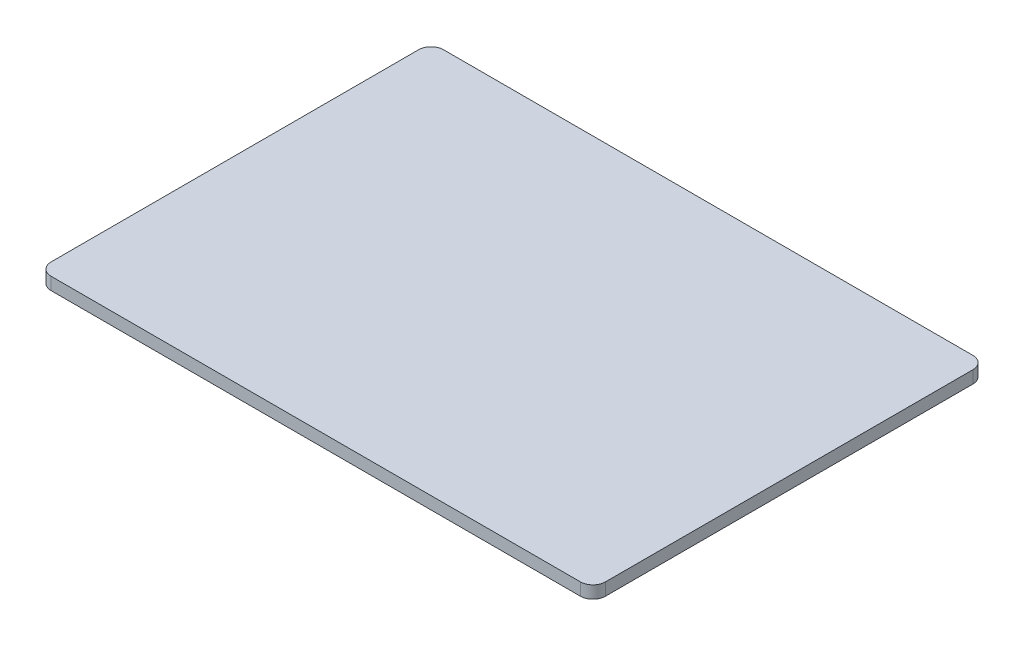
ISO-10303-21;
HEADER;
FILE_DESCRIPTION(('STEP AP214'),'2;1');
FILE_NAME('part.step','',(''),(''),'','','');
FILE_SCHEMA(('AUTOMOTIVE_DESIGN { 1 0 10303 214 1 1 1 1 }'));
ENDSEC;
DATA;
#1=APPLICATION_CONTEXT('core data for automotive mechanical design processes');
#2=APPLICATION_PROTOCOL_DEFINITION('international standard','automotive_design',2000,#1);
#3=PRODUCT_CONTEXT('',#1,'mechanical');
#4=PRODUCT('Part','Part','',(#3));
#5=PRODUCT_RELATED_PRODUCT_CATEGORY('part','',(#4));
#6=PRODUCT_DEFINITION_FORMATION('','',#4);
#7=PRODUCT_DEFINITION_CONTEXT('part definition',#1,'design');
#8=PRODUCT_DEFINITION('design','',#6,#7);
#9=PRODUCT_DEFINITION_SHAPE('','',#8);
#10=(LENGTH_UNIT() NAMED_UNIT(*) SI_UNIT(.MILLI.,.METRE.));
#11=(NAMED_UNIT(*) PLANE_ANGLE_UNIT() SI_UNIT($,.RADIAN.));
#12=(NAMED_UNIT(*) SI_UNIT($,.STERADIAN.) SOLID_ANGLE_UNIT());
#13=UNCERTAINTY_MEASURE_WITH_UNIT(LENGTH_MEASURE(1.E-05),#10,'distance_accuracy_value','');
#14=(GEOMETRIC_REPRESENTATION_CONTEXT(3) GLOBAL_UNCERTAINTY_ASSIGNED_CONTEXT((#13)) GLOBAL_UNIT_ASSIGNED_CONTEXT((#10,
#11,#12)) REPRESENTATION_CONTEXT('',''));
#15=CARTESIAN_POINT('',(0.,0.,0.));
#16=DIRECTION('',(0.,0.,1.));
#17=DIRECTION('',(1.,0.,0.));
#18=AXIS2_PLACEMENT_3D('',#15,#16,#17);
#19=CARTESIAN_POINT('',(110.46,2.54,-77.46));
#20=DIRECTION('',(0.,-1.,0.));
#21=DIRECTION('',(0.,0.,-1.));
#22=AXIS2_PLACEMENT_3D('',#19,#20,#21);
#23=CYLINDRICAL_SURFACE('',#22,2.54);
#24=CARTESIAN_POINT('',(110.46,0.,-77.46));
#25=DIRECTION('',(0.,1.,0.));
#26=DIRECTION('',(0.,0.,-1.));
#27=AXIS2_PLACEMENT_3D('',#24,#25,#26);
#28=CIRCLE('',#27,2.54);
#29=CARTESIAN_POINT('',(113.,0.,-77.46));
#30=VERTEX_POINT('',#29);
#31=CARTESIAN_POINT('',(110.46,0.,-80.));
#32=VERTEX_POINT('',#31);
#33=EDGE_CURVE('E130',#30,#32,#28,.T.);
#34=ORIENTED_EDGE('',*,*,#33,.T.);
#35=DIRECTION('',(0.,-1.,0.));
#36=VECTOR('',#35,1.);
#37=CARTESIAN_POINT('',(110.46,2.54,-80.));
#38=LINE('',#37,#36);
#39=CARTESIAN_POINT('',(110.46,2.54,-80.));
#40=VERTEX_POINT('',#39);
#41=EDGE_CURVE('E11',#40,#32,#38,.T.);
#42=ORIENTED_EDGE('',*,*,#41,.F.);
#43=CARTESIAN_POINT('',(110.46,2.54,-77.46));
#44=DIRECTION('',(0.,1.,0.));
#45=DIRECTION('',(0.,0.,-1.));
#46=AXIS2_PLACEMENT_3D('',#43,#44,#45);
#47=CIRCLE('',#46,2.54);
#48=CARTESIAN_POINT('',(113.,2.54,-77.46));
#49=VERTEX_POINT('',#48);
#50=EDGE_CURVE('E144',#49,#40,#47,.T.);
#51=ORIENTED_EDGE('',*,*,#50,.F.);
#52=DIRECTION('',(0.,-1.,0.));
#53=VECTOR('',#52,1.);
#54=CARTESIAN_POINT('',(113.,2.54,-77.46));
#55=LINE('',#54,#53);
#56=EDGE_CURVE('E126',#49,#30,#55,.T.);
#57=ORIENTED_EDGE('',*,*,#56,.T.);
#58=EDGE_LOOP('',(#34,#42,#51,#57));
#59=FACE_BOUND('',#58,.T.);
#60=ADVANCED_FACE('F34',(#59),#23,.T.);
#61=CARTESIAN_POINT('',(2.54000000000002,2.54,-80.));
#62=DIRECTION('',(0.,0.,1.));
#63=DIRECTION('',(1.,0.,0.));
#64=AXIS2_PLACEMENT_3D('',#61,#62,#63);
#65=PLANE('',#64);
#66=DIRECTION('',(-1.,0.,0.));
#67=VECTOR('',#66,1.);
#68=CARTESIAN_POINT('',(2.54000000000002,0.,-80.));
#69=LINE('',#68,#67);
#70=CARTESIAN_POINT('',(2.54000000000002,0.,-80.));
#71=VERTEX_POINT('',#70);
#72=EDGE_CURVE('E133',#32,#71,#69,.T.);
#73=ORIENTED_EDGE('',*,*,#72,.T.);
#74=DIRECTION('',(0.,-1.,0.));
#75=VECTOR('',#74,1.);
#76=CARTESIAN_POINT('',(2.54000000000002,2.54,-80.));
#77=LINE('',#76,#75);
#78=CARTESIAN_POINT('',(2.54000000000002,2.54,-80.));
#79=VERTEX_POINT('',#78);
#80=EDGE_CURVE('E42',#79,#71,#77,.T.);
#81=ORIENTED_EDGE('',*,*,#80,.F.);
#82=DIRECTION('',(-1.,0.,0.));
#83=VECTOR('',#82,1.);
#84=CARTESIAN_POINT('',(2.54000000000002,2.54,-80.));
#85=LINE('',#84,#83);
#86=EDGE_CURVE('E93',#40,#79,#85,.T.);
#87=ORIENTED_EDGE('',*,*,#86,.F.);
#88=ORIENTED_EDGE('',*,*,#41,.T.);
#89=EDGE_LOOP('',(#73,#81,#87,#88));
#90=FACE_BOUND('',#89,.T.);
#91=ADVANCED_FACE('F179',(#90),#65,.F.);
#92=CARTESIAN_POINT('',(2.54,2.54,-77.46));
#93=DIRECTION('',(0.,-1.,0.));
#94=DIRECTION('',(0.,0.,-1.));
#95=AXIS2_PLACEMENT_3D('',#92,#93,#94);
#96=CYLINDRICAL_SURFACE('',#95,2.54);
#97=CARTESIAN_POINT('',(2.54,0.,-77.46));
#98=DIRECTION('',(0.,1.,0.));
#99=DIRECTION('',(0.,0.,-1.));
#100=AXIS2_PLACEMENT_3D('',#97,#98,#99);
#101=CIRCLE('',#100,2.54);
#102=CARTESIAN_POINT('',(0.,0.,-77.46));
#103=VERTEX_POINT('',#102);
#104=EDGE_CURVE('E135',#71,#103,#101,.T.);
#105=ORIENTED_EDGE('',*,*,#104,.T.);
#106=DIRECTION('',(0.,-1.,0.));
#107=VECTOR('',#106,1.);
#108=CARTESIAN_POINT('',(0.,2.54,-77.46));
#109=LINE('',#108,#107);
#110=CARTESIAN_POINT('',(0.,2.54,-77.46));
#111=VERTEX_POINT('',#110);
#112=EDGE_CURVE('E151',#111,#103,#109,.T.);
#113=ORIENTED_EDGE('',*,*,#112,.F.);
#114=CARTESIAN_POINT('',(2.54,2.54,-77.46));
#115=DIRECTION('',(0.,1.,0.));
#116=DIRECTION('',(0.,0.,-1.));
#117=AXIS2_PLACEMENT_3D('',#114,#115,#116);
#118=CIRCLE('',#117,2.54);
#119=EDGE_CURVE('E159',#79,#111,#118,.T.);
#120=ORIENTED_EDGE('',*,*,#119,.F.);
#121=ORIENTED_EDGE('',*,*,#80,.T.);
#122=EDGE_LOOP('',(#105,#113,#120,#121));
#123=FACE_BOUND('',#122,.T.);
#124=ADVANCED_FACE('F157',(#123),#96,.T.);
#125=CARTESIAN_POINT('',(0.,2.54,-2.54000000000002));
#126=DIRECTION('',(1.,0.,0.));
#127=DIRECTION('',(0.,0.,-1.));
#128=AXIS2_PLACEMENT_3D('',#125,#126,#127);
#129=PLANE('',#128);
#130=DIRECTION('',(0.,0.,1.));
#131=VECTOR('',#130,1.);
#132=CARTESIAN_POINT('',(0.,0.,-2.54000000000002));
#133=LINE('',#132,#131);
#134=CARTESIAN_POINT('',(0.,0.,-2.54000000000002));
#135=VERTEX_POINT('',#134);
#136=EDGE_CURVE('E137',#103,#135,#133,.T.);
#137=ORIENTED_EDGE('',*,*,#136,.T.);
#138=DIRECTION('',(0.,-1.,0.));
#139=VECTOR('',#138,1.);
#140=CARTESIAN_POINT('',(0.,2.54,-2.54000000000002));
#141=LINE('',#140,#139);
#142=CARTESIAN_POINT('',(0.,2.54,-2.54000000000002));
#143=VERTEX_POINT('',#142);
#144=EDGE_CURVE('E148',#143,#135,#141,.T.);
#145=ORIENTED_EDGE('',*,*,#144,.F.);
#146=DIRECTION('',(0.,0.,1.));
#147=VECTOR('',#146,1.);
#148=CARTESIAN_POINT('',(0.,2.54,-2.54000000000002));
#149=LINE('',#148,#147);
#150=EDGE_CURVE('E171',#111,#143,#149,.T.);
#151=ORIENTED_EDGE('',*,*,#150,.F.);
#152=ORIENTED_EDGE('',*,*,#112,.T.);
#153=EDGE_LOOP('',(#137,#145,#151,#152));
#154=FACE_BOUND('',#153,.T.);
#155=ADVANCED_FACE('F167',(#154),#129,.F.);
#156=CARTESIAN_POINT('',(2.54,2.54,-2.54));
#157=DIRECTION('',(0.,-1.,0.));
#158=DIRECTION('',(0.,0.,-1.));
#159=AXIS2_PLACEMENT_3D('',#156,#157,#158);
#160=CYLINDRICAL_SURFACE('',#159,2.54);
#161=CARTESIAN_POINT('',(2.54,0.,-2.54));
#162=DIRECTION('',(0.,1.,0.));
#163=DIRECTION('',(0.,0.,-1.));
#164=AXIS2_PLACEMENT_3D('',#161,#162,#163);
#165=CIRCLE('',#164,2.54);
#166=CARTESIAN_POINT('',(2.54000000000002,0.,0.));
#167=VERTEX_POINT('',#166);
#168=EDGE_CURVE('E139',#135,#167,#165,.T.);
#169=ORIENTED_EDGE('',*,*,#168,.T.);
#170=DIRECTION('',(0.,-1.,0.));
#171=VECTOR('',#170,1.);
#172=CARTESIAN_POINT('',(2.54000000000002,2.54,0.));
#173=LINE('',#172,#171);
#174=CARTESIAN_POINT('',(2.54000000000002,2.54,0.));
#175=VERTEX_POINT('',#174);
#176=EDGE_CURVE('E121',#175,#167,#173,.T.);
#177=ORIENTED_EDGE('',*,*,#176,.F.);
#178=CARTESIAN_POINT('',(2.54,2.54,-2.54));
#179=DIRECTION('',(0.,1.,0.));
#180=DIRECTION('',(0.,0.,-1.));
#181=AXIS2_PLACEMENT_3D('',#178,#179,#180);
#182=CIRCLE('',#181,2.54);
#183=EDGE_CURVE('E112',#143,#175,#182,.T.);
#184=ORIENTED_EDGE('',*,*,#183,.F.);
#185=ORIENTED_EDGE('',*,*,#144,.T.);
#186=EDGE_LOOP('',(#169,#177,#184,#185));
#187=FACE_BOUND('',#186,.T.);
#188=ADVANCED_FACE('F170',(#187),#160,.T.);
#189=CARTESIAN_POINT('',(2.54000000000002,2.54,0.));
#190=DIRECTION('',(0.,0.,-1.));
#191=DIRECTION('',(-1.,0.,0.));
#192=AXIS2_PLACEMENT_3D('',#189,#190,#191);
#193=PLANE('',#192);
#194=DIRECTION('',(1.,0.,0.));
#195=VECTOR('',#194,1.);
#196=CARTESIAN_POINT('',(2.54000000000002,0.,0.));
#197=LINE('',#196,#195);
#198=CARTESIAN_POINT('',(110.46,0.,0.));
#199=VERTEX_POINT('',#198);
#200=EDGE_CURVE('E120',#167,#199,#197,.T.);
#201=ORIENTED_EDGE('',*,*,#200,.T.);
#202=DIRECTION('',(0.,-1.,0.));
#203=VECTOR('',#202,1.);
#204=CARTESIAN_POINT('',(110.46,2.54,0.));
#205=LINE('',#204,#203);
#206=CARTESIAN_POINT('',(110.46,2.54,0.));
#207=VERTEX_POINT('',#206);
#208=EDGE_CURVE('E117',#207,#199,#205,.T.);
#209=ORIENTED_EDGE('',*,*,#208,.F.);
#210=DIRECTION('',(1.,0.,0.));
#211=VECTOR('',#210,1.);
#212=CARTESIAN_POINT('',(2.54000000000002,2.54,0.));
#213=LINE('',#212,#211);
#214=EDGE_CURVE('E106',#175,#207,#213,.T.);
#215=ORIENTED_EDGE('',*,*,#214,.F.);
#216=ORIENTED_EDGE('',*,*,#176,.T.);
#217=EDGE_LOOP('',(#201,#209,#215,#216));
#218=FACE_BOUND('',#217,.T.);
#219=ADVANCED_FACE('F118',(#218),#193,.F.);
#220=CARTESIAN_POINT('',(110.46,2.54,-2.54));
#221=DIRECTION('',(0.,-1.,0.));
#222=DIRECTION('',(0.,0.,-1.));
#223=AXIS2_PLACEMENT_3D('',#220,#221,#222);
#224=CYLINDRICAL_SURFACE('',#223,2.54);
#225=CARTESIAN_POINT('',(110.46,0.,-2.54));
#226=DIRECTION('',(0.,1.,0.));
#227=DIRECTION('',(0.,0.,1.));
#228=AXIS2_PLACEMENT_3D('',#225,#226,#227);
#229=CIRCLE('',#228,2.54);
#230=CARTESIAN_POINT('',(113.,0.,-2.54000000000002));
#231=VERTEX_POINT('',#230);
#232=EDGE_CURVE('E79',#199,#231,#229,.T.);
#233=ORIENTED_EDGE('',*,*,#232,.T.);
#234=DIRECTION('',(0.,-1.,0.));
#235=VECTOR('',#234,1.);
#236=CARTESIAN_POINT('',(113.,2.54,-2.54000000000002));
#237=LINE('',#236,#235);
#238=CARTESIAN_POINT('',(113.,2.54,-2.54000000000002));
#239=VERTEX_POINT('',#238);
#240=EDGE_CURVE('E122',#239,#231,#237,.T.);
#241=ORIENTED_EDGE('',*,*,#240,.F.);
#242=CARTESIAN_POINT('',(110.46,2.54,-2.54));
#243=DIRECTION('',(0.,1.,0.));
#244=DIRECTION('',(0.,0.,1.));
#245=AXIS2_PLACEMENT_3D('',#242,#243,#244);
#246=CIRCLE('',#245,2.54);
#247=EDGE_CURVE('E110',#207,#239,#246,.T.);
#248=ORIENTED_EDGE('',*,*,#247,.F.);
#249=ORIENTED_EDGE('',*,*,#208,.T.);
#250=EDGE_LOOP('',(#233,#241,#248,#249));
#251=FACE_BOUND('',#250,.T.);
#252=ADVANCED_FACE('F124',(#251),#224,.T.);
#253=CARTESIAN_POINT('',(113.,2.54,-2.54000000000002));
#254=DIRECTION('',(-1.,0.,0.));
#255=DIRECTION('',(0.,0.,1.));
#256=AXIS2_PLACEMENT_3D('',#253,#254,#255);
#257=PLANE('',#256);
#258=DIRECTION('',(0.,0.,-1.));
#259=VECTOR('',#258,1.);
#260=CARTESIAN_POINT('',(113.,0.,-2.54000000000002));
#261=LINE('',#260,#259);
#262=EDGE_CURVE('E85',#231,#30,#261,.T.);
#263=ORIENTED_EDGE('',*,*,#262,.T.);
#264=ORIENTED_EDGE('',*,*,#56,.F.);
#265=DIRECTION('',(0.,0.,-1.));
#266=VECTOR('',#265,1.);
#267=CARTESIAN_POINT('',(113.,2.54,-2.54000000000002));
#268=LINE('',#267,#266);
#269=EDGE_CURVE('E50',#239,#49,#268,.T.);
#270=ORIENTED_EDGE('',*,*,#269,.F.);
#271=ORIENTED_EDGE('',*,*,#240,.T.);
#272=EDGE_LOOP('',(#263,#264,#270,#271));
#273=FACE_BOUND('',#272,.T.);
#274=ADVANCED_FACE('F195',(#273),#257,.F.);
#275=CARTESIAN_POINT('',(110.46,2.54,-77.46));
#276=DIRECTION('',(0.,-1.,0.));
#277=DIRECTION('',(0.,0.,-1.));
#278=AXIS2_PLACEMENT_3D('',#275,#276,#277);
#279=PLANE('',#278);
#280=ORIENTED_EDGE('',*,*,#50,.T.);
#281=ORIENTED_EDGE('',*,*,#86,.T.);
#282=ORIENTED_EDGE('',*,*,#119,.T.);
#283=ORIENTED_EDGE('',*,*,#150,.T.);
#284=ORIENTED_EDGE('',*,*,#183,.T.);
#285=ORIENTED_EDGE('',*,*,#214,.T.);
#286=ORIENTED_EDGE('',*,*,#247,.T.);
#287=ORIENTED_EDGE('',*,*,#269,.T.);
#288=EDGE_LOOP('',(#280,#281,#282,#283,#284,#285,#286,#287));
#289=FACE_BOUND('',#288,.T.);
#290=ADVANCED_FACE('F108',(#289),#279,.F.);
#291=CARTESIAN_POINT('',(110.46,0.,-77.46));
#292=DIRECTION('',(0.,-1.,0.));
#293=DIRECTION('',(0.,0.,-1.));
#294=AXIS2_PLACEMENT_3D('',#291,#292,#293);
#295=PLANE('',#294);
#296=ORIENTED_EDGE('',*,*,#33,.F.);
#297=ORIENTED_EDGE('',*,*,#262,.F.);
#298=ORIENTED_EDGE('',*,*,#232,.F.);
#299=ORIENTED_EDGE('',*,*,#200,.F.);
#300=ORIENTED_EDGE('',*,*,#168,.F.);
#301=ORIENTED_EDGE('',*,*,#136,.F.);
#302=ORIENTED_EDGE('',*,*,#104,.F.);
#303=ORIENTED_EDGE('',*,*,#72,.F.);
#304=EDGE_LOOP('',(#296,#297,#298,#299,#300,#301,#302,#303));
#305=FACE_BOUND('',#304,.T.);
#306=ADVANCED_FACE('F163',(#305),#295,.T.);
#307=CLOSED_SHELL('',(#60,#91,#124,#155,#188,#219,#252,#274,#290,#306));
#308=MANIFOLD_SOLID_BREP('B2',#307);
#309=ADVANCED_BREP_SHAPE_REPRESENTATION('',(#18,#308),#14);
#310=SHAPE_DEFINITION_REPRESENTATION(#9,#309);
ENDSEC;
END-ISO-10303-21;
